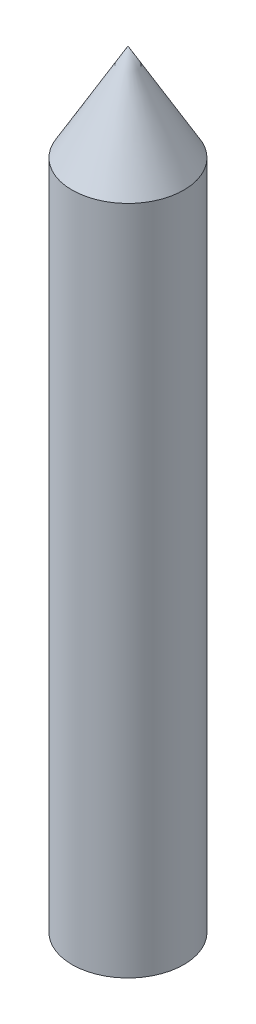
ISO-10303-21;
HEADER;
FILE_DESCRIPTION(('STEP AP214'),'2;1');
FILE_NAME('part.step','',(''),(''),'','','');
FILE_SCHEMA(('AUTOMOTIVE_DESIGN { 1 0 10303 214 1 1 1 1 }'));
ENDSEC;
DATA;
#1=APPLICATION_CONTEXT('core data for automotive mechanical design processes');
#2=APPLICATION_PROTOCOL_DEFINITION('international standard','automotive_design',2000,#1);
#3=PRODUCT_CONTEXT('',#1,'mechanical');
#4=PRODUCT('Part','Part','',(#3));
#5=PRODUCT_RELATED_PRODUCT_CATEGORY('part','',(#4));
#6=PRODUCT_DEFINITION_FORMATION('','',#4);
#7=PRODUCT_DEFINITION_CONTEXT('part definition',#1,'design');
#8=PRODUCT_DEFINITION('design','',#6,#7);
#9=PRODUCT_DEFINITION_SHAPE('','',#8);
#10=(LENGTH_UNIT() NAMED_UNIT(*) SI_UNIT(.MILLI.,.METRE.));
#11=(NAMED_UNIT(*) PLANE_ANGLE_UNIT() SI_UNIT($,.RADIAN.));
#12=(NAMED_UNIT(*) SI_UNIT($,.STERADIAN.) SOLID_ANGLE_UNIT());
#13=UNCERTAINTY_MEASURE_WITH_UNIT(LENGTH_MEASURE(1.E-05),#10,'distance_accuracy_value','');
#14=(GEOMETRIC_REPRESENTATION_CONTEXT(3) GLOBAL_UNCERTAINTY_ASSIGNED_CONTEXT((#13)) GLOBAL_UNIT_ASSIGNED_CONTEXT((#10,
#11,#12)) REPRESENTATION_CONTEXT('',''));
#15=CARTESIAN_POINT('',(0.,0.,0.));
#16=DIRECTION('',(0.,0.,1.));
#17=DIRECTION('',(1.,0.,0.));
#18=AXIS2_PLACEMENT_3D('',#15,#16,#17);
#19=CARTESIAN_POINT('',(0.,0.,0.));
#20=DIRECTION('',(0.,1.,0.));
#21=DIRECTION('',(0.,0.,1.));
#22=AXIS2_PLACEMENT_3D('',#19,#20,#21);
#23=PLANE('',#22);
#24=CARTESIAN_POINT('',(0.,0.,0.));
#25=DIRECTION('',(0.,1.,0.));
#26=DIRECTION('',(0.,0.,1.));
#27=AXIS2_PLACEMENT_3D('',#24,#25,#26);
#28=CIRCLE('',#27,12.7);
#29=CARTESIAN_POINT('',(0.,0.,12.7));
#30=VERTEX_POINT('',#29);
#31=EDGE_CURVE('E11',#30,#30,#28,.T.);
#32=ORIENTED_EDGE('',*,*,#31,.F.);
#33=EDGE_LOOP('',(#32));
#34=FACE_BOUND('',#33,.T.);
#35=ADVANCED_FACE('F41',(#34),#23,.F.);
#36=CARTESIAN_POINT('',(0.,-180.,0.));
#37=DIRECTION('',(0.,1.,0.));
#38=DIRECTION('',(0.,0.,1.));
#39=AXIS2_PLACEMENT_3D('',#36,#37,#38);
#40=CYLINDRICAL_SURFACE('',#39,12.7);
#41=CARTESIAN_POINT('',(0.,-180.,0.));
#42=DIRECTION('',(0.,1.,0.));
#43=DIRECTION('',(0.,0.,1.));
#44=AXIS2_PLACEMENT_3D('',#41,#42,#43);
#45=CIRCLE('',#44,12.7);
#46=CARTESIAN_POINT('',(0.,-180.,12.7));
#47=VERTEX_POINT('',#46);
#48=EDGE_CURVE('E60',#47,#47,#45,.T.);
#49=CARTESIAN_POINT('',(0.,-180.,12.7));
#50=CARTESIAN_POINT('',(0.,-178.125,12.7));
#51=CARTESIAN_POINT('',(0.,-176.25,12.7));
#52=CARTESIAN_POINT('',(0.,-172.5,12.7));
#53=CARTESIAN_POINT('',(0.,-170.625,12.7));
#54=CARTESIAN_POINT('',(0.,-166.875,12.7));
#55=CARTESIAN_POINT('',(0.,-165.,12.7));
#56=CARTESIAN_POINT('',(0.,-161.25,12.7));
#57=CARTESIAN_POINT('',(0.,-159.375,12.7));
#58=CARTESIAN_POINT('',(0.,-155.625,12.7));
#59=CARTESIAN_POINT('',(0.,-153.75,12.7));
#60=CARTESIAN_POINT('',(0.,-150.,12.7));
#61=CARTESIAN_POINT('',(0.,-148.125,12.7));
#62=CARTESIAN_POINT('',(0.,-144.375,12.7));
#63=CARTESIAN_POINT('',(0.,-142.5,12.7));
#64=CARTESIAN_POINT('',(0.,-138.75,12.7));
#65=CARTESIAN_POINT('',(0.,-136.875,12.7));
#66=CARTESIAN_POINT('',(0.,-133.125,12.7));
#67=CARTESIAN_POINT('',(0.,-131.25,12.7));
#68=CARTESIAN_POINT('',(0.,-127.5,12.7));
#69=CARTESIAN_POINT('',(0.,-125.625,12.7));
#70=CARTESIAN_POINT('',(0.,-121.875,12.7));
#71=CARTESIAN_POINT('',(0.,-120.,12.7));
#72=CARTESIAN_POINT('',(0.,-116.25,12.7));
#73=CARTESIAN_POINT('',(0.,-114.375,12.7));
#74=CARTESIAN_POINT('',(0.,-110.625,12.7));
#75=CARTESIAN_POINT('',(0.,-108.75,12.7));
#76=CARTESIAN_POINT('',(0.,-105.,12.7));
#77=CARTESIAN_POINT('',(0.,-103.125,12.7));
#78=CARTESIAN_POINT('',(0.,-99.375,12.7));
#79=CARTESIAN_POINT('',(0.,-97.5,12.7));
#80=CARTESIAN_POINT('',(0.,-93.75,12.7));
#81=CARTESIAN_POINT('',(0.,-91.875,12.7));
#82=CARTESIAN_POINT('',(0.,-88.125,12.7));
#83=CARTESIAN_POINT('',(0.,-86.25,12.7));
#84=CARTESIAN_POINT('',(0.,-82.5,12.7));
#85=CARTESIAN_POINT('',(0.,-80.625,12.7));
#86=CARTESIAN_POINT('',(0.,-76.875,12.7));
#87=CARTESIAN_POINT('',(0.,-75.,12.7));
#88=CARTESIAN_POINT('',(0.,-71.25,12.7));
#89=CARTESIAN_POINT('',(0.,-69.375,12.7));
#90=CARTESIAN_POINT('',(0.,-65.625,12.7));
#91=CARTESIAN_POINT('',(0.,-63.75,12.7));
#92=CARTESIAN_POINT('',(0.,-60.,12.7));
#93=CARTESIAN_POINT('',(0.,-58.125,12.7));
#94=CARTESIAN_POINT('',(0.,-54.375,12.7));
#95=CARTESIAN_POINT('',(0.,-52.5,12.7));
#96=CARTESIAN_POINT('',(0.,-48.75,12.7));
#97=CARTESIAN_POINT('',(0.,-46.875,12.7));
#98=CARTESIAN_POINT('',(0.,-43.125,12.7));
#99=CARTESIAN_POINT('',(0.,-41.25,12.7));
#100=CARTESIAN_POINT('',(0.,-37.5,12.7));
#101=CARTESIAN_POINT('',(0.,-35.625,12.7));
#102=CARTESIAN_POINT('',(0.,-31.875,12.7));
#103=CARTESIAN_POINT('',(0.,-30.,12.7));
#104=CARTESIAN_POINT('',(0.,-26.25,12.7));
#105=CARTESIAN_POINT('',(0.,-24.375,12.7));
#106=CARTESIAN_POINT('',(0.,-20.625,12.7));
#107=CARTESIAN_POINT('',(0.,-18.75,12.7));
#108=CARTESIAN_POINT('',(0.,-15.,12.7));
#109=CARTESIAN_POINT('',(0.,-13.125,12.7));
#110=CARTESIAN_POINT('',(0.,-9.37500000000003,12.7));
#111=CARTESIAN_POINT('',(0.,-7.50000000000002,12.7));
#112=CARTESIAN_POINT('',(0.,-3.75000000000002,12.7));
#113=CARTESIAN_POINT('',(0.,-1.87500000000003,12.7));
#114=CARTESIAN_POINT('',(0.,0.,12.7));
#115=B_SPLINE_CURVE_WITH_KNOTS('',3,(#49,#50,#51,#52,#53,#54,#55,#56,#57,#58,#59,#60,#61,#62,
#63,#64,#65,#66,#67,#68,#69,#70,#71,#72,#73,#74,#75,#76,#77,#78,#79,#80,#81,#82,#83,#84,#85,#86,
#87,#88,#89,#90,#91,#92,#93,#94,#95,#96,#97,#98,#99,#100,#101,#102,#103,#104,#105,#106,#107,
#108,#109,#110,#111,#112,#113,#114),.UNSPECIFIED.,.F.,.F.,(4,2,2,2,2,2,2,2,2,2,2,2,2,2,2,2,2,2,
2,2,2,2,2,2,2,2,2,2,2,2,2,2,4),(0.,5.62500000000002,11.25,16.875,22.5,28.125,33.75,39.375,45.,
50.625,56.25,61.875,67.5,73.125,78.75,84.375,90.,95.625,101.25,106.875,112.5,118.125,123.75,
129.375,135.,140.625,146.25,151.875,157.5,163.125,168.75,174.375,180.),.UNSPECIFIED.);
#116=EDGE_CURVE('BSEAM77',#47,#30,#115,.T.);
#117=ORIENTED_EDGE('',*,*,#48,.F.);
#118=ORIENTED_EDGE('',*,*,#31,.T.);
#119=ORIENTED_EDGE('',*,*,#116,.T.);
#120=ORIENTED_EDGE('',*,*,#116,.F.);
#121=EDGE_LOOP('',(#117,#119,#118,#120));
#122=FACE_BOUND('',#121,.T.);
#123=ADVANCED_FACE('F77',(#122),#40,.F.);
#124=CARTESIAN_POINT('',(0.,-180.,0.));
#125=DIRECTION('',(0.,1.,0.));
#126=DIRECTION('',(0.,0.,1.));
#127=AXIS2_PLACEMENT_3D('',#124,#125,#126);
#128=CYLINDRICAL_SURFACE('',#127,15.);
#129=CARTESIAN_POINT('',(0.,-180.,0.));
#130=DIRECTION('',(0.,1.,0.));
#131=DIRECTION('',(0.,0.,1.));
#132=AXIS2_PLACEMENT_3D('',#129,#130,#131);
#133=CIRCLE('',#132,15.);
#134=CARTESIAN_POINT('',(0.,-180.,15.));
#135=VERTEX_POINT('',#134);
#136=EDGE_CURVE('E49',#135,#135,#133,.T.);
#137=CARTESIAN_POINT('',(0.,0.,0.));
#138=DIRECTION('',(0.,1.,0.));
#139=DIRECTION('',(0.,0.,1.));
#140=AXIS2_PLACEMENT_3D('',#137,#138,#139);
#141=CIRCLE('',#140,15.);
#142=CARTESIAN_POINT('',(0.,0.,15.));
#143=VERTEX_POINT('',#142);
#144=EDGE_CURVE('E57',#143,#143,#141,.T.);
#145=CARTESIAN_POINT('',(0.,-180.,15.));
#146=CARTESIAN_POINT('',(0.,-178.125,15.));
#147=CARTESIAN_POINT('',(0.,-176.25,15.));
#148=CARTESIAN_POINT('',(0.,-172.5,15.));
#149=CARTESIAN_POINT('',(0.,-170.625,15.));
#150=CARTESIAN_POINT('',(0.,-166.875,15.));
#151=CARTESIAN_POINT('',(0.,-165.,15.));
#152=CARTESIAN_POINT('',(0.,-161.25,15.));
#153=CARTESIAN_POINT('',(0.,-159.375,15.));
#154=CARTESIAN_POINT('',(0.,-155.625,15.));
#155=CARTESIAN_POINT('',(0.,-153.75,15.));
#156=CARTESIAN_POINT('',(0.,-150.,15.));
#157=CARTESIAN_POINT('',(0.,-148.125,15.));
#158=CARTESIAN_POINT('',(0.,-144.375,15.));
#159=CARTESIAN_POINT('',(0.,-142.5,15.));
#160=CARTESIAN_POINT('',(0.,-138.75,15.));
#161=CARTESIAN_POINT('',(0.,-136.875,15.));
#162=CARTESIAN_POINT('',(0.,-133.125,15.));
#163=CARTESIAN_POINT('',(0.,-131.25,15.));
#164=CARTESIAN_POINT('',(0.,-127.5,15.));
#165=CARTESIAN_POINT('',(0.,-125.625,15.));
#166=CARTESIAN_POINT('',(0.,-121.875,15.));
#167=CARTESIAN_POINT('',(0.,-120.,15.));
#168=CARTESIAN_POINT('',(0.,-116.25,15.));
#169=CARTESIAN_POINT('',(0.,-114.375,15.));
#170=CARTESIAN_POINT('',(0.,-110.625,15.));
#171=CARTESIAN_POINT('',(0.,-108.75,15.));
#172=CARTESIAN_POINT('',(0.,-105.,15.));
#173=CARTESIAN_POINT('',(0.,-103.125,15.));
#174=CARTESIAN_POINT('',(0.,-99.375,15.));
#175=CARTESIAN_POINT('',(0.,-97.5,15.));
#176=CARTESIAN_POINT('',(0.,-93.75,15.));
#177=CARTESIAN_POINT('',(0.,-91.875,15.));
#178=CARTESIAN_POINT('',(0.,-88.125,15.));
#179=CARTESIAN_POINT('',(0.,-86.25,15.));
#180=CARTESIAN_POINT('',(0.,-82.5,15.));
#181=CARTESIAN_POINT('',(0.,-80.625,15.));
#182=CARTESIAN_POINT('',(0.,-76.875,15.));
#183=CARTESIAN_POINT('',(0.,-75.,15.));
#184=CARTESIAN_POINT('',(0.,-71.25,15.));
#185=CARTESIAN_POINT('',(0.,-69.375,15.));
#186=CARTESIAN_POINT('',(0.,-65.625,15.));
#187=CARTESIAN_POINT('',(0.,-63.75,15.));
#188=CARTESIAN_POINT('',(0.,-60.,15.));
#189=CARTESIAN_POINT('',(0.,-58.125,15.));
#190=CARTESIAN_POINT('',(0.,-54.375,15.));
#191=CARTESIAN_POINT('',(0.,-52.5,15.));
#192=CARTESIAN_POINT('',(0.,-48.75,15.));
#193=CARTESIAN_POINT('',(0.,-46.875,15.));
#194=CARTESIAN_POINT('',(0.,-43.125,15.));
#195=CARTESIAN_POINT('',(0.,-41.25,15.));
#196=CARTESIAN_POINT('',(0.,-37.5,15.));
#197=CARTESIAN_POINT('',(0.,-35.625,15.));
#198=CARTESIAN_POINT('',(0.,-31.875,15.));
#199=CARTESIAN_POINT('',(0.,-30.,15.));
#200=CARTESIAN_POINT('',(0.,-26.25,15.));
#201=CARTESIAN_POINT('',(0.,-24.375,15.));
#202=CARTESIAN_POINT('',(0.,-20.625,15.));
#203=CARTESIAN_POINT('',(0.,-18.75,15.));
#204=CARTESIAN_POINT('',(0.,-15.,15.));
#205=CARTESIAN_POINT('',(0.,-13.125,15.));
#206=CARTESIAN_POINT('',(0.,-9.37500000000003,15.));
#207=CARTESIAN_POINT('',(0.,-7.50000000000002,15.));
#208=CARTESIAN_POINT('',(0.,-3.75000000000002,15.));
#209=CARTESIAN_POINT('',(0.,-1.87500000000003,15.));
#210=CARTESIAN_POINT('',(0.,0.,15.));
#211=B_SPLINE_CURVE_WITH_KNOTS('',3,(#145,#146,#147,#148,#149,#150,#151,#152,#153,#154,#155,
#156,#157,#158,#159,#160,#161,#162,#163,#164,#165,#166,#167,#168,#169,#170,#171,#172,#173,#174,
#175,#176,#177,#178,#179,#180,#181,#182,#183,#184,#185,#186,#187,#188,#189,#190,#191,#192,#193,
#194,#195,#196,#197,#198,#199,#200,#201,#202,#203,#204,#205,#206,#207,#208,#209,#210),
.UNSPECIFIED.,.F.,.F.,(4,2,2,2,2,2,2,2,2,2,2,2,2,2,2,2,2,2,2,2,2,2,2,2,2,2,2,2,2,2,2,2,4),(0.,
5.62499999999999,11.25,16.875,22.5,28.125,33.75,39.375,45.,50.625,56.25,61.875,67.5,73.125,
78.75,84.375,90.,95.625,101.25,106.875,112.5,118.125,123.75,129.375,135.,140.625,146.25,151.875,
157.5,163.125,168.75,174.375,180.),.UNSPECIFIED.);
#212=EDGE_CURVE('BSEAM69',#135,#143,#211,.T.);
#213=ORIENTED_EDGE('',*,*,#136,.T.);
#214=ORIENTED_EDGE('',*,*,#144,.F.);
#215=ORIENTED_EDGE('',*,*,#212,.T.);
#216=ORIENTED_EDGE('',*,*,#212,.F.);
#217=EDGE_LOOP('',(#213,#215,#214,#216));
#218=FACE_BOUND('',#217,.T.);
#219=ADVANCED_FACE('F69',(#218),#128,.T.);
#220=CARTESIAN_POINT('',(0.,-180.,0.));
#221=DIRECTION('',(0.,1.,0.));
#222=DIRECTION('',(0.,0.,1.));
#223=AXIS2_PLACEMENT_3D('',#220,#221,#222);
#224=PLANE('',#223);
#225=ORIENTED_EDGE('',*,*,#48,.T.);
#226=EDGE_LOOP('',(#225));
#227=FACE_BOUND('',#226,.T.);
#228=ORIENTED_EDGE('',*,*,#136,.F.);
#229=EDGE_LOOP('',(#228));
#230=FACE_BOUND('',#229,.T.);
#231=ADVANCED_FACE('F54',(#227,#230),#224,.F.);
#232=CARTESIAN_POINT('',(0.,0.,0.));
#233=DIRECTION('',(0.,-1.,0.));
#234=DIRECTION('',(0.,0.,1.));
#235=AXIS2_PLACEMENT_3D('',#232,#233,#234);
#236=CONICAL_SURFACE('',#235,15.,0.5235987755983);
#237=CARTESIAN_POINT('',(0.,25.9807621135331,0.));
#238=VERTEX_POINT('',#237);
#239=VERTEX_LOOP('',#238);
#240=FACE_BOUND('',#239,.T.);
#241=ORIENTED_EDGE('',*,*,#144,.T.);
#242=EDGE_LOOP('',(#241));
#243=FACE_BOUND('',#242,.T.);
#244=ADVANCED_FACE('F43',(#240,#243),#236,.T.);
#245=CLOSED_SHELL('',(#35,#123,#219,#231,#244));
#246=MANIFOLD_SOLID_BREP('B2',#245);
#247=ADVANCED_BREP_SHAPE_REPRESENTATION('',(#18,#246),#14);
#248=SHAPE_DEFINITION_REPRESENTATION(#9,#247);
ENDSEC;
END-ISO-10303-21;
